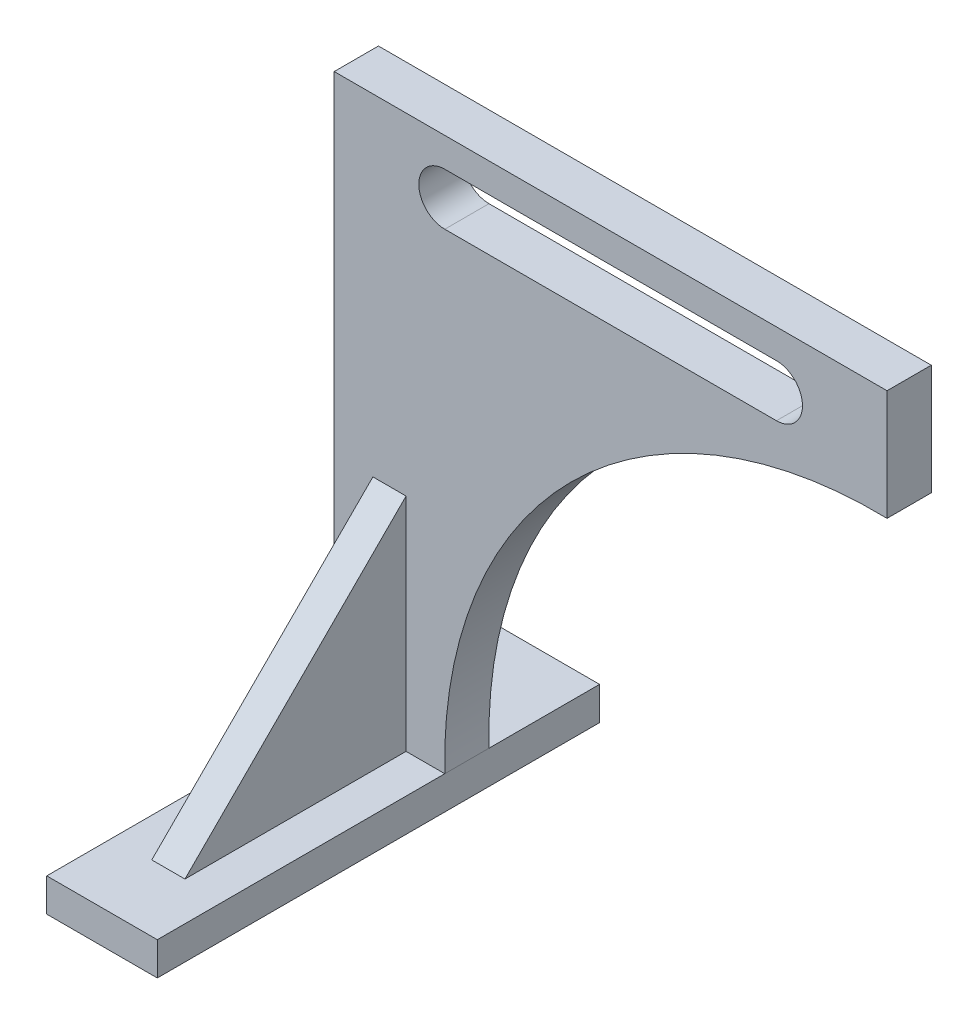
ISO-10303-21;
HEADER;
FILE_DESCRIPTION(('STEP AP214'),'2;1');
FILE_NAME('part.step','',(''),(''),'','','');
FILE_SCHEMA(('AUTOMOTIVE_DESIGN { 1 0 10303 214 1 1 1 1 }'));
ENDSEC;
DATA;
#1=APPLICATION_CONTEXT('core data for automotive mechanical design processes');
#2=APPLICATION_PROTOCOL_DEFINITION('international standard','automotive_design',2000,#1);
#3=PRODUCT_CONTEXT('',#1,'mechanical');
#4=PRODUCT('Part','Part','',(#3));
#5=PRODUCT_RELATED_PRODUCT_CATEGORY('part','',(#4));
#6=PRODUCT_DEFINITION_FORMATION('','',#4);
#7=PRODUCT_DEFINITION_CONTEXT('part definition',#1,'design');
#8=PRODUCT_DEFINITION('design','',#6,#7);
#9=PRODUCT_DEFINITION_SHAPE('','',#8);
#10=(LENGTH_UNIT() NAMED_UNIT(*) SI_UNIT(.MILLI.,.METRE.));
#11=(NAMED_UNIT(*) PLANE_ANGLE_UNIT() SI_UNIT($,.RADIAN.));
#12=(NAMED_UNIT(*) SI_UNIT($,.STERADIAN.) SOLID_ANGLE_UNIT());
#13=UNCERTAINTY_MEASURE_WITH_UNIT(LENGTH_MEASURE(1.E-05),#10,'distance_accuracy_value','');
#14=(GEOMETRIC_REPRESENTATION_CONTEXT(3) GLOBAL_UNCERTAINTY_ASSIGNED_CONTEXT((#13)) GLOBAL_UNIT_ASSIGNED_CONTEXT((#10,
#11,#12)) REPRESENTATION_CONTEXT('',''));
#15=CARTESIAN_POINT('',(0.,0.,0.));
#16=DIRECTION('',(0.,0.,1.));
#17=DIRECTION('',(1.,0.,0.));
#18=AXIS2_PLACEMENT_3D('',#15,#16,#17);
#19=CARTESIAN_POINT('',(0.,15.,0.));
#20=DIRECTION('',(0.,1.,0.));
#21=DIRECTION('',(0.,0.,1.));
#22=AXIS2_PLACEMENT_3D('',#19,#20,#21);
#23=PLANE('',#22);
#24=DIRECTION('',(-1.,0.,0.));
#25=VECTOR('',#24,1.);
#26=CARTESIAN_POINT('',(-25.,15.,-30.));
#27=LINE('',#26,#25);
#28=CARTESIAN_POINT('',(25.,15.,-30.));
#29=VERTEX_POINT('',#28);
#30=CARTESIAN_POINT('',(7.5,15.,-30.));
#31=VERTEX_POINT('',#30);
#32=EDGE_CURVE('E166',#29,#31,#27,.T.);
#33=ORIENTED_EDGE('',*,*,#32,.T.);
#34=DIRECTION('',(0.,0.,1.));
#35=VECTOR('',#34,1.);
#36=CARTESIAN_POINT('',(7.5,15.,70.));
#37=LINE('',#36,#35);
#38=CARTESIAN_POINT('',(7.5,15.,70.));
#39=VERTEX_POINT('',#38);
#40=EDGE_CURVE('E151',#31,#39,#37,.T.);
#41=ORIENTED_EDGE('',*,*,#40,.T.);
#42=DIRECTION('',(-1.,0.,0.));
#43=VECTOR('',#42,1.);
#44=CARTESIAN_POINT('',(7.5,15.,70.));
#45=LINE('',#44,#43);
#46=CARTESIAN_POINT('',(-7.5,15.,70.));
#47=VERTEX_POINT('',#46);
#48=EDGE_CURVE('E272',#39,#47,#45,.T.);
#49=ORIENTED_EDGE('',*,*,#48,.T.);
#50=DIRECTION('',(0.,0.,1.));
#51=VECTOR('',#50,1.);
#52=CARTESIAN_POINT('',(-7.5,15.,70.));
#53=LINE('',#52,#51);
#54=CARTESIAN_POINT('',(-7.5,15.,-30.));
#55=VERTEX_POINT('',#54);
#56=EDGE_CURVE('E271',#55,#47,#53,.T.);
#57=ORIENTED_EDGE('',*,*,#56,.F.);
#58=CARTESIAN_POINT('',(-25.,15.,-30.));
#59=VERTEX_POINT('',#58);
#60=EDGE_CURVE('E173',#55,#59,#27,.T.);
#61=ORIENTED_EDGE('',*,*,#60,.T.);
#62=DIRECTION('',(0.,0.,1.));
#63=VECTOR('',#62,1.);
#64=CARTESIAN_POINT('',(-25.,15.,100.));
#65=LINE('',#64,#63);
#66=CARTESIAN_POINT('',(-25.,15.,100.));
#67=VERTEX_POINT('',#66);
#68=EDGE_CURVE('E202',#59,#67,#65,.T.);
#69=ORIENTED_EDGE('',*,*,#68,.T.);
#70=DIRECTION('',(1.,0.,0.));
#71=VECTOR('',#70,1.);
#72=CARTESIAN_POINT('',(25.,15.,100.));
#73=LINE('',#72,#71);
#74=CARTESIAN_POINT('',(25.,15.,100.));
#75=VERTEX_POINT('',#74);
#76=EDGE_CURVE('E201',#67,#75,#73,.T.);
#77=ORIENTED_EDGE('',*,*,#76,.T.);
#78=DIRECTION('',(0.,0.,-1.));
#79=VECTOR('',#78,1.);
#80=CARTESIAN_POINT('',(25.,15.,100.));
#81=LINE('',#80,#79);
#82=EDGE_CURVE('E170',#75,#29,#81,.T.);
#83=ORIENTED_EDGE('',*,*,#82,.T.);
#84=EDGE_LOOP('',(#33,#41,#49,#57,#61,#69,#77,#83));
#85=FACE_BOUND('',#84,.T.);
#86=ADVANCED_FACE('F37',(#85),#23,.T.);
#87=CARTESIAN_POINT('',(220.242033787609,19.7579662123912,-30.));
#88=DIRECTION('',(0.,0.,-1.));
#89=DIRECTION('',(-1.,0.,0.));
#90=AXIS2_PLACEMENT_3D('',#87,#88,#89);
#91=PLANE('',#90);
#92=CARTESIAN_POINT('',(25.,240.,-30.));
#93=DIRECTION('',(0.,0.,-1.));
#94=DIRECTION('',(-1.,0.,0.));
#95=AXIS2_PLACEMENT_3D('',#92,#93,#94);
#96=CIRCLE('',#95,11.75);
#97=CARTESIAN_POINT('',(25.,228.25,-30.));
#98=VERTEX_POINT('',#97);
#99=CARTESIAN_POINT('',(25.,251.75,-30.));
#100=VERTEX_POINT('',#99);
#101=EDGE_CURVE('E279',#98,#100,#96,.T.);
#102=ORIENTED_EDGE('',*,*,#101,.T.);
#103=DIRECTION('',(1.,0.,0.));
#104=VECTOR('',#103,1.);
#105=CARTESIAN_POINT('',(25.,251.75,-30.));
#106=LINE('',#105,#104);
#107=CARTESIAN_POINT('',(175.,251.75,-30.));
#108=VERTEX_POINT('',#107);
#109=EDGE_CURVE('E294',#100,#108,#106,.T.);
#110=ORIENTED_EDGE('',*,*,#109,.T.);
#111=CARTESIAN_POINT('',(175.,240.,-30.));
#112=DIRECTION('',(0.,0.,-1.));
#113=DIRECTION('',(-1.,0.,0.));
#114=AXIS2_PLACEMENT_3D('',#111,#112,#113);
#115=CIRCLE('',#114,11.75);
#116=CARTESIAN_POINT('',(175.,228.25,-30.));
#117=VERTEX_POINT('',#116);
#118=EDGE_CURVE('E297',#108,#117,#115,.T.);
#119=ORIENTED_EDGE('',*,*,#118,.T.);
#120=DIRECTION('',(-1.,0.,0.));
#121=VECTOR('',#120,1.);
#122=CARTESIAN_POINT('',(25.,228.25,-30.));
#123=LINE('',#122,#121);
#124=EDGE_CURVE('E284',#117,#98,#123,.T.);
#125=ORIENTED_EDGE('',*,*,#124,.T.);
#126=EDGE_LOOP('',(#102,#110,#119,#125));
#127=FACE_BOUND('',#126,.T.);
#128=DIRECTION('',(0.,-1.,0.));
#129=VECTOR('',#128,1.);
#130=CARTESIAN_POINT('',(7.5,15.,-30.));
#131=LINE('',#130,#129);
#132=CARTESIAN_POINT('',(7.5,115.,-30.));
#133=VERTEX_POINT('',#132);
#134=EDGE_CURVE('E154',#133,#31,#131,.T.);
#135=ORIENTED_EDGE('',*,*,#134,.T.);
#136=ORIENTED_EDGE('',*,*,#32,.F.);
#137=CARTESIAN_POINT('',(220.242033787609,19.7579662123912,-30.));
#138=DIRECTION('',(0.,0.,1.));
#139=DIRECTION('',(-1.,0.,0.));
#140=AXIS2_PLACEMENT_3D('',#137,#138,#139);
#141=CIRCLE('',#140,195.3);
#142=CARTESIAN_POINT('',(225.,215.,-30.));
#143=VERTEX_POINT('',#142);
#144=EDGE_CURVE('E185',#143,#29,#141,.T.);
#145=ORIENTED_EDGE('',*,*,#144,.F.);
#146=DIRECTION('',(0.,-1.,0.));
#147=VECTOR('',#146,1.);
#148=CARTESIAN_POINT('',(225.,265.,-30.));
#149=LINE('',#148,#147);
#150=CARTESIAN_POINT('',(225.,265.,-30.));
#151=VERTEX_POINT('',#150);
#152=EDGE_CURVE('E183',#151,#143,#149,.T.);
#153=ORIENTED_EDGE('',*,*,#152,.F.);
#154=DIRECTION('',(1.,0.,0.));
#155=VECTOR('',#154,1.);
#156=CARTESIAN_POINT('',(-25.,265.,-30.));
#157=LINE('',#156,#155);
#158=CARTESIAN_POINT('',(-25.,265.,-30.));
#159=VERTEX_POINT('',#158);
#160=EDGE_CURVE('E175',#159,#151,#157,.T.);
#161=ORIENTED_EDGE('',*,*,#160,.F.);
#162=DIRECTION('',(0.,1.,0.));
#163=VECTOR('',#162,1.);
#164=CARTESIAN_POINT('',(-25.,15.,-30.));
#165=LINE('',#164,#163);
#166=EDGE_CURVE('E172',#59,#159,#165,.T.);
#167=ORIENTED_EDGE('',*,*,#166,.F.);
#168=ORIENTED_EDGE('',*,*,#60,.F.);
#169=DIRECTION('',(0.,-1.,0.));
#170=VECTOR('',#169,1.);
#171=CARTESIAN_POINT('',(-7.5,15.,-30.));
#172=LINE('',#171,#170);
#173=CARTESIAN_POINT('',(-7.50000000000001,115.,-30.));
#174=VERTEX_POINT('',#173);
#175=EDGE_CURVE('E269',#174,#55,#172,.T.);
#176=ORIENTED_EDGE('',*,*,#175,.F.);
#177=DIRECTION('',(-1.,0.,0.));
#178=VECTOR('',#177,1.);
#179=CARTESIAN_POINT('',(7.5,115.,-30.));
#180=LINE('',#179,#178);
#181=EDGE_CURVE('E168',#133,#174,#180,.T.);
#182=ORIENTED_EDGE('',*,*,#181,.F.);
#183=EDGE_LOOP('',(#135,#136,#145,#153,#161,#167,#168,#176,#182));
#184=FACE_BOUND('',#183,.T.);
#185=ADVANCED_FACE('F164',(#127,#184),#91,.F.);
#186=CARTESIAN_POINT('',(-25.,15.,100.));
#187=DIRECTION('',(1.,0.,0.));
#188=DIRECTION('',(0.,0.,-1.));
#189=AXIS2_PLACEMENT_3D('',#186,#187,#188);
#190=PLANE('',#189);
#191=DIRECTION('',(0.,0.,1.));
#192=VECTOR('',#191,1.);
#193=CARTESIAN_POINT('',(-25.,0.,100.));
#194=LINE('',#193,#192);
#195=CARTESIAN_POINT('',(-25.,0.,-100.));
#196=VERTEX_POINT('',#195);
#197=CARTESIAN_POINT('',(-25.,0.,100.));
#198=VERTEX_POINT('',#197);
#199=EDGE_CURVE('E198',#196,#198,#194,.T.);
#200=ORIENTED_EDGE('',*,*,#199,.T.);
#201=DIRECTION('',(0.,-1.,0.));
#202=VECTOR('',#201,1.);
#203=CARTESIAN_POINT('',(-25.,15.,100.));
#204=LINE('',#203,#202);
#205=EDGE_CURVE('E12',#67,#198,#204,.T.);
#206=ORIENTED_EDGE('',*,*,#205,.F.);
#207=ORIENTED_EDGE('',*,*,#68,.F.);
#208=ORIENTED_EDGE('',*,*,#166,.T.);
#209=DIRECTION('',(0.,0.,1.));
#210=VECTOR('',#209,1.);
#211=CARTESIAN_POINT('',(-25.,265.,-50.));
#212=LINE('',#211,#210);
#213=CARTESIAN_POINT('',(-25.,265.,-50.));
#214=VERTEX_POINT('',#213);
#215=EDGE_CURVE('E195',#214,#159,#212,.T.);
#216=ORIENTED_EDGE('',*,*,#215,.F.);
#217=DIRECTION('',(0.,1.,0.));
#218=VECTOR('',#217,1.);
#219=CARTESIAN_POINT('',(-25.,15.,-50.));
#220=LINE('',#219,#218);
#221=CARTESIAN_POINT('',(-25.,15.,-50.));
#222=VERTEX_POINT('',#221);
#223=EDGE_CURVE('E241',#222,#214,#220,.T.);
#224=ORIENTED_EDGE('',*,*,#223,.F.);
#225=CARTESIAN_POINT('',(-25.,15.,-100.));
#226=VERTEX_POINT('',#225);
#227=EDGE_CURVE('E199',#226,#222,#65,.T.);
#228=ORIENTED_EDGE('',*,*,#227,.F.);
#229=DIRECTION('',(0.,-1.,0.));
#230=VECTOR('',#229,1.);
#231=CARTESIAN_POINT('',(-25.,15.,-100.));
#232=LINE('',#231,#230);
#233=EDGE_CURVE('E208',#226,#196,#232,.T.);
#234=ORIENTED_EDGE('',*,*,#233,.T.);
#235=EDGE_LOOP('',(#200,#206,#207,#208,#216,#224,#228,#234));
#236=FACE_BOUND('',#235,.T.);
#237=ADVANCED_FACE('F39',(#236),#190,.F.);
#238=CARTESIAN_POINT('',(25.,15.,100.));
#239=DIRECTION('',(0.,0.,-1.));
#240=DIRECTION('',(-1.,0.,0.));
#241=AXIS2_PLACEMENT_3D('',#238,#239,#240);
#242=PLANE('',#241);
#243=DIRECTION('',(1.,0.,0.));
#244=VECTOR('',#243,1.);
#245=CARTESIAN_POINT('',(25.,0.,100.));
#246=LINE('',#245,#244);
#247=CARTESIAN_POINT('',(25.,0.,100.));
#248=VERTEX_POINT('',#247);
#249=EDGE_CURVE('E211',#198,#248,#246,.T.);
#250=ORIENTED_EDGE('',*,*,#249,.T.);
#251=DIRECTION('',(0.,-1.,0.));
#252=VECTOR('',#251,1.);
#253=CARTESIAN_POINT('',(25.,15.,100.));
#254=LINE('',#253,#252);
#255=EDGE_CURVE('E45',#75,#248,#254,.T.);
#256=ORIENTED_EDGE('',*,*,#255,.F.);
#257=ORIENTED_EDGE('',*,*,#76,.F.);
#258=ORIENTED_EDGE('',*,*,#205,.T.);
#259=EDGE_LOOP('',(#250,#256,#257,#258));
#260=FACE_BOUND('',#259,.T.);
#261=ADVANCED_FACE('F355',(#260),#242,.F.);
#262=CARTESIAN_POINT('',(25.,15.,100.));
#263=DIRECTION('',(-1.,0.,0.));
#264=DIRECTION('',(0.,0.,1.));
#265=AXIS2_PLACEMENT_3D('',#262,#263,#264);
#266=PLANE('',#265);
#267=DIRECTION('',(0.,0.,-1.));
#268=VECTOR('',#267,1.);
#269=CARTESIAN_POINT('',(25.,0.,100.));
#270=LINE('',#269,#268);
#271=CARTESIAN_POINT('',(25.,0.,-100.));
#272=VERTEX_POINT('',#271);
#273=EDGE_CURVE('E213',#248,#272,#270,.T.);
#274=ORIENTED_EDGE('',*,*,#273,.T.);
#275=DIRECTION('',(0.,-1.,0.));
#276=VECTOR('',#275,1.);
#277=CARTESIAN_POINT('',(25.,15.,-100.));
#278=LINE('',#277,#276);
#279=CARTESIAN_POINT('',(25.,15.,-100.));
#280=VERTEX_POINT('',#279);
#281=EDGE_CURVE('E219',#280,#272,#278,.T.);
#282=ORIENTED_EDGE('',*,*,#281,.F.);
#283=CARTESIAN_POINT('',(25.,15.,-50.));
#284=VERTEX_POINT('',#283);
#285=EDGE_CURVE('E204',#284,#280,#81,.T.);
#286=ORIENTED_EDGE('',*,*,#285,.F.);
#287=DIRECTION('',(0.,0.,1.));
#288=VECTOR('',#287,1.);
#289=CARTESIAN_POINT('',(25.,15.,-50.));
#290=LINE('',#289,#288);
#291=EDGE_CURVE('E60',#284,#29,#290,.T.);
#292=ORIENTED_EDGE('',*,*,#291,.T.);
#293=ORIENTED_EDGE('',*,*,#82,.F.);
#294=ORIENTED_EDGE('',*,*,#255,.T.);
#295=EDGE_LOOP('',(#274,#282,#286,#292,#293,#294));
#296=FACE_BOUND('',#295,.T.);
#297=ADVANCED_FACE('F224',(#296),#266,.F.);
#298=CARTESIAN_POINT('',(25.,15.,-100.));
#299=DIRECTION('',(0.,0.,1.));
#300=DIRECTION('',(1.,0.,0.));
#301=AXIS2_PLACEMENT_3D('',#298,#299,#300);
#302=PLANE('',#301);
#303=DIRECTION('',(-1.,0.,0.));
#304=VECTOR('',#303,1.);
#305=CARTESIAN_POINT('',(25.,0.,-100.));
#306=LINE('',#305,#304);
#307=EDGE_CURVE('E215',#272,#196,#306,.T.);
#308=ORIENTED_EDGE('',*,*,#307,.T.);
#309=ORIENTED_EDGE('',*,*,#233,.F.);
#310=DIRECTION('',(-1.,0.,0.));
#311=VECTOR('',#310,1.);
#312=CARTESIAN_POINT('',(25.,15.,-100.));
#313=LINE('',#312,#311);
#314=EDGE_CURVE('E206',#280,#226,#313,.T.);
#315=ORIENTED_EDGE('',*,*,#314,.F.);
#316=ORIENTED_EDGE('',*,*,#281,.T.);
#317=EDGE_LOOP('',(#308,#309,#315,#316));
#318=FACE_BOUND('',#317,.T.);
#319=ADVANCED_FACE('F234',(#318),#302,.F.);
#320=DIRECTION('',(-1.,0.,0.));
#321=VECTOR('',#320,1.);
#322=CARTESIAN_POINT('',(-25.,15.,-50.));
#323=LINE('',#322,#321);
#324=EDGE_CURVE('E187',#284,#222,#323,.T.);
#325=ORIENTED_EDGE('',*,*,#324,.F.);
#326=ORIENTED_EDGE('',*,*,#285,.T.);
#327=ORIENTED_EDGE('',*,*,#314,.T.);
#328=ORIENTED_EDGE('',*,*,#227,.T.);
#329=EDGE_LOOP('',(#325,#326,#327,#328));
#330=FACE_BOUND('',#329,.T.);
#331=ADVANCED_FACE('F245',(#330),#23,.T.);
#332=CARTESIAN_POINT('',(0.,0.,0.));
#333=DIRECTION('',(0.,1.,0.));
#334=DIRECTION('',(0.,0.,1.));
#335=AXIS2_PLACEMENT_3D('',#332,#333,#334);
#336=PLANE('',#335);
#337=ORIENTED_EDGE('',*,*,#199,.F.);
#338=ORIENTED_EDGE('',*,*,#307,.F.);
#339=ORIENTED_EDGE('',*,*,#273,.F.);
#340=ORIENTED_EDGE('',*,*,#249,.F.);
#341=EDGE_LOOP('',(#337,#338,#339,#340));
#342=FACE_BOUND('',#341,.T.);
#343=ADVANCED_FACE('F231',(#342),#336,.F.);
#344=CARTESIAN_POINT('',(220.242033787609,19.7579662123912,-50.));
#345=DIRECTION('',(0.,0.,-1.));
#346=DIRECTION('',(-1.,0.,0.));
#347=AXIS2_PLACEMENT_3D('',#344,#345,#346);
#348=PLANE('',#347);
#349=ORIENTED_EDGE('',*,*,#324,.T.);
#350=ORIENTED_EDGE('',*,*,#223,.T.);
#351=DIRECTION('',(1.,0.,0.));
#352=VECTOR('',#351,1.);
#353=CARTESIAN_POINT('',(-25.,265.,-50.));
#354=LINE('',#353,#352);
#355=CARTESIAN_POINT('',(225.,265.,-50.));
#356=VERTEX_POINT('',#355);
#357=EDGE_CURVE('E266',#214,#356,#354,.T.);
#358=ORIENTED_EDGE('',*,*,#357,.T.);
#359=DIRECTION('',(0.,-1.,0.));
#360=VECTOR('',#359,1.);
#361=CARTESIAN_POINT('',(225.,265.,-50.));
#362=LINE('',#361,#360);
#363=CARTESIAN_POINT('',(225.,215.,-50.));
#364=VERTEX_POINT('',#363);
#365=EDGE_CURVE('E253',#356,#364,#362,.T.);
#366=ORIENTED_EDGE('',*,*,#365,.T.);
#367=CARTESIAN_POINT('',(220.242033787609,19.7579662123912,-50.));
#368=DIRECTION('',(0.,0.,1.));
#369=DIRECTION('',(-1.,0.,0.));
#370=AXIS2_PLACEMENT_3D('',#367,#368,#369);
#371=CIRCLE('',#370,195.3);
#372=EDGE_CURVE('E179',#364,#284,#371,.T.);
#373=ORIENTED_EDGE('',*,*,#372,.T.);
#374=EDGE_LOOP('',(#349,#350,#358,#366,#373));
#375=FACE_BOUND('',#374,.T.);
#376=DIRECTION('',(1.,0.,0.));
#377=VECTOR('',#376,1.);
#378=CARTESIAN_POINT('',(25.,251.75,-50.));
#379=LINE('',#378,#377);
#380=CARTESIAN_POINT('',(25.,251.75,-50.));
#381=VERTEX_POINT('',#380);
#382=CARTESIAN_POINT('',(175.,251.75,-50.));
#383=VERTEX_POINT('',#382);
#384=EDGE_CURVE('E283',#381,#383,#379,.T.);
#385=ORIENTED_EDGE('',*,*,#384,.F.);
#386=CARTESIAN_POINT('',(25.,240.,-50.));
#387=DIRECTION('',(0.,0.,-1.));
#388=DIRECTION('',(-1.,0.,0.));
#389=AXIS2_PLACEMENT_3D('',#386,#387,#388);
#390=CIRCLE('',#389,11.75);
#391=CARTESIAN_POINT('',(25.,228.25,-50.));
#392=VERTEX_POINT('',#391);
#393=EDGE_CURVE('E281',#392,#381,#390,.T.);
#394=ORIENTED_EDGE('',*,*,#393,.F.);
#395=DIRECTION('',(-1.,0.,0.));
#396=VECTOR('',#395,1.);
#397=CARTESIAN_POINT('',(25.,228.25,-50.));
#398=LINE('',#397,#396);
#399=CARTESIAN_POINT('',(175.,228.25,-50.));
#400=VERTEX_POINT('',#399);
#401=EDGE_CURVE('E289',#400,#392,#398,.T.);
#402=ORIENTED_EDGE('',*,*,#401,.F.);
#403=CARTESIAN_POINT('',(175.,240.,-50.));
#404=DIRECTION('',(0.,0.,-1.));
#405=DIRECTION('',(-1.,0.,0.));
#406=AXIS2_PLACEMENT_3D('',#403,#404,#405);
#407=CIRCLE('',#406,11.75);
#408=EDGE_CURVE('E286',#383,#400,#407,.T.);
#409=ORIENTED_EDGE('',*,*,#408,.F.);
#410=EDGE_LOOP('',(#385,#394,#402,#409));
#411=FACE_BOUND('',#410,.T.);
#412=ADVANCED_FACE('F250',(#375,#411),#348,.T.);
#413=CARTESIAN_POINT('',(-25.,265.,-50.));
#414=DIRECTION('',(0.,-1.,0.));
#415=DIRECTION('',(1.,0.,0.));
#416=AXIS2_PLACEMENT_3D('',#413,#414,#415);
#417=PLANE('',#416);
#418=ORIENTED_EDGE('',*,*,#160,.T.);
#419=DIRECTION('',(0.,0.,1.));
#420=VECTOR('',#419,1.);
#421=CARTESIAN_POINT('',(225.,265.,-50.));
#422=LINE('',#421,#420);
#423=EDGE_CURVE('E192',#356,#151,#422,.T.);
#424=ORIENTED_EDGE('',*,*,#423,.F.);
#425=ORIENTED_EDGE('',*,*,#357,.F.);
#426=ORIENTED_EDGE('',*,*,#215,.T.);
#427=EDGE_LOOP('',(#418,#424,#425,#426));
#428=FACE_BOUND('',#427,.T.);
#429=ADVANCED_FACE('F265',(#428),#417,.F.);
#430=CARTESIAN_POINT('',(225.,265.,-50.));
#431=DIRECTION('',(-1.,0.,0.));
#432=DIRECTION('',(0.,0.,1.));
#433=AXIS2_PLACEMENT_3D('',#430,#431,#432);
#434=PLANE('',#433);
#435=ORIENTED_EDGE('',*,*,#152,.T.);
#436=DIRECTION('',(0.,0.,1.));
#437=VECTOR('',#436,1.);
#438=CARTESIAN_POINT('',(225.,215.,-50.));
#439=LINE('',#438,#437);
#440=EDGE_CURVE('E189',#364,#143,#439,.T.);
#441=ORIENTED_EDGE('',*,*,#440,.F.);
#442=ORIENTED_EDGE('',*,*,#365,.F.);
#443=ORIENTED_EDGE('',*,*,#423,.T.);
#444=EDGE_LOOP('',(#435,#441,#442,#443));
#445=FACE_BOUND('',#444,.T.);
#446=ADVANCED_FACE('F261',(#445),#434,.F.);
#447=CARTESIAN_POINT('',(220.242033787609,19.7579662123912,-50.));
#448=DIRECTION('',(0.,0.,1.));
#449=DIRECTION('',(1.,0.,0.));
#450=AXIS2_PLACEMENT_3D('',#447,#448,#449);
#451=CYLINDRICAL_SURFACE('',#450,195.3);
#452=ORIENTED_EDGE('',*,*,#144,.T.);
#453=ORIENTED_EDGE('',*,*,#291,.F.);
#454=ORIENTED_EDGE('',*,*,#372,.F.);
#455=ORIENTED_EDGE('',*,*,#440,.T.);
#456=EDGE_LOOP('',(#452,#453,#454,#455));
#457=FACE_BOUND('',#456,.T.);
#458=ADVANCED_FACE('F256',(#457),#451,.F.);
#459=CARTESIAN_POINT('',(25.,240.,-50.));
#460=DIRECTION('',(0.,0.,1.));
#461=DIRECTION('',(1.,0.,0.));
#462=AXIS2_PLACEMENT_3D('',#459,#460,#461);
#463=CYLINDRICAL_SURFACE('',#462,11.75);
#464=ORIENTED_EDGE('',*,*,#101,.F.);
#465=DIRECTION('',(0.,0.,1.));
#466=VECTOR('',#465,1.);
#467=CARTESIAN_POINT('',(25.,228.25,-50.));
#468=LINE('',#467,#466);
#469=EDGE_CURVE('E291',#392,#98,#468,.T.);
#470=ORIENTED_EDGE('',*,*,#469,.F.);
#471=ORIENTED_EDGE('',*,*,#393,.T.);
#472=DIRECTION('',(0.,0.,1.));
#473=VECTOR('',#472,1.);
#474=CARTESIAN_POINT('',(25.,251.75,-50.));
#475=LINE('',#474,#473);
#476=EDGE_CURVE('E177',#381,#100,#475,.T.);
#477=ORIENTED_EDGE('',*,*,#476,.T.);
#478=EDGE_LOOP('',(#464,#470,#471,#477));
#479=FACE_BOUND('',#478,.T.);
#480=ADVANCED_FACE('F313',(#479),#463,.F.);
#481=CARTESIAN_POINT('',(25.,251.75,-50.));
#482=DIRECTION('',(0.,-1.,0.));
#483=DIRECTION('',(0.,0.,-1.));
#484=AXIS2_PLACEMENT_3D('',#481,#482,#483);
#485=PLANE('',#484);
#486=ORIENTED_EDGE('',*,*,#109,.F.);
#487=ORIENTED_EDGE('',*,*,#476,.F.);
#488=ORIENTED_EDGE('',*,*,#384,.T.);
#489=DIRECTION('',(0.,0.,1.));
#490=VECTOR('',#489,1.);
#491=CARTESIAN_POINT('',(175.,251.75,-50.));
#492=LINE('',#491,#490);
#493=EDGE_CURVE('E306',#383,#108,#492,.T.);
#494=ORIENTED_EDGE('',*,*,#493,.T.);
#495=EDGE_LOOP('',(#486,#487,#488,#494));
#496=FACE_BOUND('',#495,.T.);
#497=ADVANCED_FACE('F326',(#496),#485,.T.);
#498=CARTESIAN_POINT('',(175.,240.,-50.));
#499=DIRECTION('',(0.,0.,1.));
#500=DIRECTION('',(1.,0.,0.));
#501=AXIS2_PLACEMENT_3D('',#498,#499,#500);
#502=CYLINDRICAL_SURFACE('',#501,11.75);
#503=ORIENTED_EDGE('',*,*,#118,.F.);
#504=ORIENTED_EDGE('',*,*,#493,.F.);
#505=ORIENTED_EDGE('',*,*,#408,.T.);
#506=DIRECTION('',(0.,0.,1.));
#507=VECTOR('',#506,1.);
#508=CARTESIAN_POINT('',(175.,228.25,-50.));
#509=LINE('',#508,#507);
#510=EDGE_CURVE('E304',#400,#117,#509,.T.);
#511=ORIENTED_EDGE('',*,*,#510,.T.);
#512=EDGE_LOOP('',(#503,#504,#505,#511));
#513=FACE_BOUND('',#512,.T.);
#514=ADVANCED_FACE('F328',(#513),#502,.F.);
#515=CARTESIAN_POINT('',(25.,228.25,-50.));
#516=DIRECTION('',(0.,1.,0.));
#517=DIRECTION('',(-1.,0.,0.));
#518=AXIS2_PLACEMENT_3D('',#515,#516,#517);
#519=PLANE('',#518);
#520=ORIENTED_EDGE('',*,*,#124,.F.);
#521=ORIENTED_EDGE('',*,*,#510,.F.);
#522=ORIENTED_EDGE('',*,*,#401,.T.);
#523=ORIENTED_EDGE('',*,*,#469,.T.);
#524=EDGE_LOOP('',(#520,#521,#522,#523));
#525=FACE_BOUND('',#524,.T.);
#526=ADVANCED_FACE('F322',(#525),#519,.T.);
#527=CARTESIAN_POINT('',(7.5,115.,-30.));
#528=DIRECTION('',(0.,0.707106781186547,0.707106781186547));
#529=DIRECTION('',(0.,-0.707106781186548,0.707106781186548));
#530=AXIS2_PLACEMENT_3D('',#527,#528,#529);
#531=PLANE('',#530);
#532=DIRECTION('',(0.,0.707106781186547,-0.707106781186547));
#533=VECTOR('',#532,1.);
#534=CARTESIAN_POINT('',(-7.5,115.,-30.));
#535=LINE('',#534,#533);
#536=EDGE_CURVE('E52',#47,#174,#535,.T.);
#537=ORIENTED_EDGE('',*,*,#536,.F.);
#538=ORIENTED_EDGE('',*,*,#48,.F.);
#539=DIRECTION('',(0.,0.707106781186547,-0.707106781186547));
#540=VECTOR('',#539,1.);
#541=CARTESIAN_POINT('',(7.5,115.,-30.));
#542=LINE('',#541,#540);
#543=EDGE_CURVE('E156',#39,#133,#542,.T.);
#544=ORIENTED_EDGE('',*,*,#543,.T.);
#545=ORIENTED_EDGE('',*,*,#181,.T.);
#546=EDGE_LOOP('',(#537,#538,#544,#545));
#547=FACE_BOUND('',#546,.T.);
#548=ADVANCED_FACE('F335',(#547),#531,.T.);
#549=CARTESIAN_POINT('',(7.5,0.,0.));
#550=DIRECTION('',(-1.,0.,0.));
#551=DIRECTION('',(0.,0.,1.));
#552=AXIS2_PLACEMENT_3D('',#549,#550,#551);
#553=PLANE('',#552);
#554=ORIENTED_EDGE('',*,*,#134,.F.);
#555=ORIENTED_EDGE('',*,*,#543,.F.);
#556=ORIENTED_EDGE('',*,*,#40,.F.);
#557=EDGE_LOOP('',(#554,#555,#556));
#558=FACE_BOUND('',#557,.T.);
#559=ADVANCED_FACE('F153',(#558),#553,.F.);
#560=CARTESIAN_POINT('',(-7.5,0.,0.));
#561=DIRECTION('',(-1.,0.,0.));
#562=DIRECTION('',(0.,0.,1.));
#563=AXIS2_PLACEMENT_3D('',#560,#561,#562);
#564=PLANE('',#563);
#565=ORIENTED_EDGE('',*,*,#175,.T.);
#566=ORIENTED_EDGE('',*,*,#56,.T.);
#567=ORIENTED_EDGE('',*,*,#536,.T.);
#568=EDGE_LOOP('',(#565,#566,#567));
#569=FACE_BOUND('',#568,.T.);
#570=ADVANCED_FACE('F391',(#569),#564,.T.);
#571=CLOSED_SHELL('',(#86,#185,#237,#261,#297,#319,#331,#343,#412,#429,#446,#458,#480,#497,#514,
#526,#548,#559,#570));
#572=MANIFOLD_SOLID_BREP('B2',#571);
#573=ADVANCED_BREP_SHAPE_REPRESENTATION('',(#18,#572),#14);
#574=SHAPE_DEFINITION_REPRESENTATION(#9,#573);
ENDSEC;
END-ISO-10303-21;
